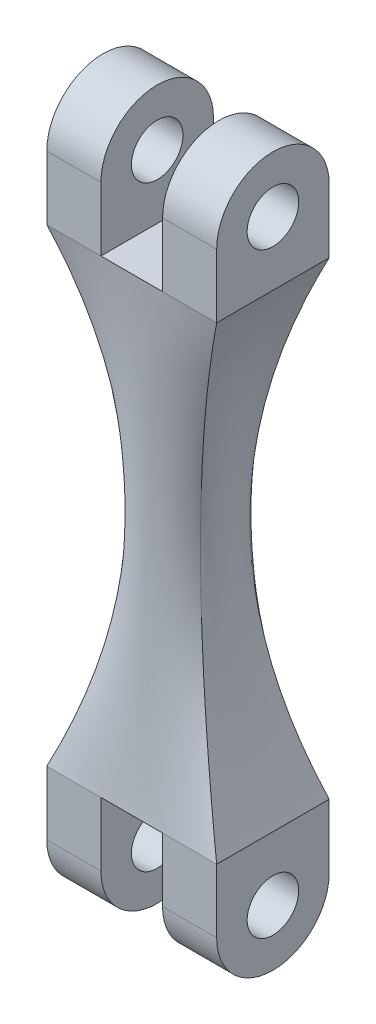
ISO-10303-21;
HEADER;
FILE_DESCRIPTION(('STEP AP214'),'2;1');
FILE_NAME('part.step','',(''),(''),'','','');
FILE_SCHEMA(('AUTOMOTIVE_DESIGN { 1 0 10303 214 1 1 1 1 }'));
ENDSEC;
DATA;
#1=APPLICATION_CONTEXT('core data for automotive mechanical design processes');
#2=APPLICATION_PROTOCOL_DEFINITION('international standard','automotive_design',2000,#1);
#3=PRODUCT_CONTEXT('',#1,'mechanical');
#4=PRODUCT('Part','Part','',(#3));
#5=PRODUCT_RELATED_PRODUCT_CATEGORY('part','',(#4));
#6=PRODUCT_DEFINITION_FORMATION('','',#4);
#7=PRODUCT_DEFINITION_CONTEXT('part definition',#1,'design');
#8=PRODUCT_DEFINITION('design','',#6,#7);
#9=PRODUCT_DEFINITION_SHAPE('','',#8);
#10=(LENGTH_UNIT() NAMED_UNIT(*) SI_UNIT(.MILLI.,.METRE.));
#11=(NAMED_UNIT(*) PLANE_ANGLE_UNIT() SI_UNIT($,.RADIAN.));
#12=(NAMED_UNIT(*) SI_UNIT($,.STERADIAN.) SOLID_ANGLE_UNIT());
#13=UNCERTAINTY_MEASURE_WITH_UNIT(LENGTH_MEASURE(1.E-05),#10,'distance_accuracy_value','');
#14=(GEOMETRIC_REPRESENTATION_CONTEXT(3) GLOBAL_UNCERTAINTY_ASSIGNED_CONTEXT((#13)) GLOBAL_UNIT_ASSIGNED_CONTEXT((#10,
#11,#12)) REPRESENTATION_CONTEXT('',''));
#15=CARTESIAN_POINT('',(0.,0.,0.));
#16=DIRECTION('',(0.,0.,1.));
#17=DIRECTION('',(1.,0.,0.));
#18=AXIS2_PLACEMENT_3D('',#15,#16,#17);
#19=CARTESIAN_POINT('',(0.,0.,0.));
#20=DIRECTION('',(0.,1.,0.));
#21=DIRECTION('',(0.,0.,1.));
#22=AXIS2_PLACEMENT_3D('',#19,#20,#21);
#23=PLANE('',#22);
#24=DIRECTION('',(-1.,0.,0.));
#25=VECTOR('',#24,1.);
#26=CARTESIAN_POINT('',(-4.529,0.,-3.));
#27=LINE('',#26,#25);
#28=CARTESIAN_POINT('',(1.643,0.,-3.));
#29=VERTEX_POINT('',#28);
#30=CARTESIAN_POINT('',(-1.643,0.,-3.));
#31=VERTEX_POINT('',#30);
#32=EDGE_CURVE('E472',#29,#31,#27,.T.);
#33=ORIENTED_EDGE('',*,*,#32,.F.);
#34=DIRECTION('',(0.,0.,1.));
#35=VECTOR('',#34,1.);
#36=CARTESIAN_POINT('',(1.643,0.,3.));
#37=LINE('',#36,#35);
#38=CARTESIAN_POINT('',(1.643,0.,3.));
#39=VERTEX_POINT('',#38);
#40=EDGE_CURVE('E736',#29,#39,#37,.T.);
#41=ORIENTED_EDGE('',*,*,#40,.T.);
#42=DIRECTION('',(1.,0.,0.));
#43=VECTOR('',#42,1.);
#44=CARTESIAN_POINT('',(-4.529,0.,3.));
#45=LINE('',#44,#43);
#46=CARTESIAN_POINT('',(-1.643,0.,3.));
#47=VERTEX_POINT('',#46);
#48=EDGE_CURVE('E351',#47,#39,#45,.T.);
#49=ORIENTED_EDGE('',*,*,#48,.F.);
#50=DIRECTION('',(0.,0.,1.));
#51=VECTOR('',#50,1.);
#52=CARTESIAN_POINT('',(-1.643,0.,3.));
#53=LINE('',#52,#51);
#54=EDGE_CURVE('E409',#31,#47,#53,.T.);
#55=ORIENTED_EDGE('',*,*,#54,.F.);
#56=EDGE_LOOP('',(#33,#41,#49,#55));
#57=FACE_BOUND('',#56,.T.);
#58=ADVANCED_FACE('F83',(#57),#23,.F.);
#59=CARTESIAN_POINT('',(0.,25.,0.));
#60=DIRECTION('',(0.,-1.,0.));
#61=DIRECTION('',(0.,0.,-1.));
#62=AXIS2_PLACEMENT_3D('',#59,#60,#61);
#63=PLANE('',#62);
#64=DIRECTION('',(1.,0.,0.));
#65=VECTOR('',#64,1.);
#66=CARTESIAN_POINT('',(-4.529,25.,3.));
#67=LINE('',#66,#65);
#68=CARTESIAN_POINT('',(-1.643,25.,3.));
#69=VERTEX_POINT('',#68);
#70=CARTESIAN_POINT('',(1.643,25.,3.));
#71=VERTEX_POINT('',#70);
#72=EDGE_CURVE('E94',#69,#71,#67,.T.);
#73=ORIENTED_EDGE('',*,*,#72,.T.);
#74=DIRECTION('',(0.,0.,1.));
#75=VECTOR('',#74,1.);
#76=CARTESIAN_POINT('',(1.643,25.,3.));
#77=LINE('',#76,#75);
#78=CARTESIAN_POINT('',(1.643,25.,-3.));
#79=VERTEX_POINT('',#78);
#80=EDGE_CURVE('E217',#79,#71,#77,.T.);
#81=ORIENTED_EDGE('',*,*,#80,.F.);
#82=DIRECTION('',(-1.,0.,0.));
#83=VECTOR('',#82,1.);
#84=CARTESIAN_POINT('',(-4.529,25.,-3.));
#85=LINE('',#84,#83);
#86=CARTESIAN_POINT('',(-1.643,25.,-3.));
#87=VERTEX_POINT('',#86);
#88=EDGE_CURVE('E344',#79,#87,#85,.T.);
#89=ORIENTED_EDGE('',*,*,#88,.T.);
#90=DIRECTION('',(0.,0.,1.));
#91=VECTOR('',#90,1.);
#92=CARTESIAN_POINT('',(-1.643,25.,3.));
#93=LINE('',#92,#91);
#94=EDGE_CURVE('E260',#87,#69,#93,.T.);
#95=ORIENTED_EDGE('',*,*,#94,.T.);
#96=EDGE_LOOP('',(#73,#81,#89,#95));
#97=FACE_BOUND('',#96,.T.);
#98=ADVANCED_FACE('F85',(#97),#63,.F.);
#99=CARTESIAN_POINT('',(-4.529,0.,3.));
#100=CARTESIAN_POINT('',(-2.82967454845478,4.16666666666667,1.87437042291109));
#101=CARTESIAN_POINT('',(-1.13034909690955,12.5,0.748740845822179));
#102=CARTESIAN_POINT('',(-2.82967454845478,20.8333333333333,1.87437042291109));
#103=CARTESIAN_POINT('',(-4.529,25.,3.));
#104=CARTESIAN_POINT('',(-4.15158333333333,0.,3.));
#105=CARTESIAN_POINT('',(-2.62298451265422,4.16666666666667,1.97864445794214));
#106=CARTESIAN_POINT('',(-1.11711278216476,12.5,0.976482291331089));
#107=CARTESIAN_POINT('',(-2.62298451265422,20.8333333333333,1.97864445794214));
#108=CARTESIAN_POINT('',(-4.15158333333333,25.,3.));
#109=CARTESIAN_POINT('',(-3.39675,0.,3.));
#110=CARTESIAN_POINT('',(-2.20960444105311,4.16666666666666,2.18719252800423));
#111=CARTESIAN_POINT('',(-1.01223163115228,12.5,1.36566080837681));
#112=CARTESIAN_POINT('',(-2.20960444105311,20.8333333333333,2.18719252800423));
#113=CARTESIAN_POINT('',(-3.39675,25.,3.));
#114=CARTESIAN_POINT('',(-1.88708333333333,0.,3.));
#115=CARTESIAN_POINT('',(-1.27993394314497,4.16666666666668,2.48170910900993));
#116=CARTESIAN_POINT('',(-0.678466627347054,12.5,1.96865270528451));
#117=CARTESIAN_POINT('',(-1.27993394314497,20.8333333333333,2.48170910900993));
#118=CARTESIAN_POINT('',(-1.88708333333333,25.,3.));
#119=CARTESIAN_POINT('',(0.,0.,3.));
#120=CARTESIAN_POINT('',(8.36980925779145E-05,4.16666666666665,2.65150795100174));
#121=CARTESIAN_POINT('',(0.000169810929422366,12.4999999999999,2.29952675477991));
#122=CARTESIAN_POINT('',(8.36980925766583E-05,20.8333333333333,2.65150795100173));
#123=CARTESIAN_POINT('',(0.,25.,3.));
#124=CARTESIAN_POINT('',(1.88708333333333,0.,3.));
#125=CARTESIAN_POINT('',(1.27977178462595,4.16666666666668,2.48175153838506));
#126=CARTESIAN_POINT('',(0.678135066076206,12.5,1.96873603117617));
#127=CARTESIAN_POINT('',(1.27977178462595,20.8333333333333,2.48175153838506));
#128=CARTESIAN_POINT('',(1.88708333333333,25.,3.));
#129=CARTESIAN_POINT('',(3.39675,0.,3.));
#130=CARTESIAN_POINT('',(2.20963100324003,4.16666666666667,2.18719865943864));
#131=CARTESIAN_POINT('',(1.01229682924744,12.5,1.36567583039112));
#132=CARTESIAN_POINT('',(2.20963100324003,20.8333333333333,2.18719865943864));
#133=CARTESIAN_POINT('',(3.39675,25.,3.));
#134=CARTESIAN_POINT('',(4.15158333333333,0.,3.));
#135=CARTESIAN_POINT('',(2.62299336671653,4.16666666666667,1.97864650175361));
#136=CARTESIAN_POINT('',(1.11710392810245,12.5,0.976480247519622));
#137=CARTESIAN_POINT('',(2.62299336671653,20.8333333333333,1.97864650175361));
#138=CARTESIAN_POINT('',(4.15158333333333,25.,3.));
#139=CARTESIAN_POINT('',(4.529,0.,3.));
#140=CARTESIAN_POINT('',(2.82967454845478,4.16666666666667,1.87437042291109));
#141=CARTESIAN_POINT('',(1.13034909690955,12.5,0.748740845822179));
#142=CARTESIAN_POINT('',(2.82967454845478,20.8333333333333,1.87437042291109));
#143=CARTESIAN_POINT('',(4.529,25.,3.));
#144=B_SPLINE_SURFACE_WITH_KNOTS('',3,3,((#99,#100,#101,#102,#103),(#104,#105,#106,#107,#108),
(#109,#110,#111,#112,#113),(#114,#115,#116,#117,#118),(#119,#120,#121,#122,#123),(#124,#125,
#126,#127,#128),(#129,#130,#131,#132,#133),(#134,#135,#136,#137,#138),(#139,#140,#141,#142,
#143)),.UNSPECIFIED.,.F.,.F.,.F.,(4,1,1,1,1,1,4),(4,1,4),(0.,0.125,0.25,0.5,0.75,0.875,1.),(0.,
0.5,1.),.UNSPECIFIED.);
#145=CARTESIAN_POINT('',(-4.529,0.,3.));
#146=VERTEX_POINT('',#145);
#147=EDGE_CURVE('E473',#146,#47,#45,.T.);
#148=DIRECTION('',(1.,0.,0.));
#149=VECTOR('',#148,1.);
#150=CARTESIAN_POINT('',(1.643,0.,3.));
#151=LINE('',#150,#149);
#152=CARTESIAN_POINT('',(4.529,0.,3.));
#153=VERTEX_POINT('',#152);
#154=EDGE_CURVE('E556',#39,#153,#151,.T.);
#155=CARTESIAN_POINT('',(4.529,0.,3.));
#156=CARTESIAN_POINT('',(2.82967454845478,4.16666666666667,1.87437042291109));
#157=CARTESIAN_POINT('',(1.13034909690955,12.5,0.748740845822179));
#158=CARTESIAN_POINT('',(2.82967454845478,20.8333333333333,1.87437042291109));
#159=CARTESIAN_POINT('',(4.529,25.,3.));
#160=B_SPLINE_CURVE_WITH_KNOTS('',3,(#155,#156,#157,#158,#159),.UNSPECIFIED.,.F.,.F.,(4,1,4),
(0.,0.5,1.),.UNSPECIFIED.);
#161=CARTESIAN_POINT('',(4.529,25.,3.));
#162=VERTEX_POINT('',#161);
#163=EDGE_CURVE('E565',#153,#162,#160,.T.);
#164=DIRECTION('',(1.,0.,0.));
#165=VECTOR('',#164,1.);
#166=CARTESIAN_POINT('',(1.643,25.,3.));
#167=LINE('',#166,#165);
#168=EDGE_CURVE('E102',#71,#162,#167,.T.);
#169=CARTESIAN_POINT('',(-4.529,25.,3.));
#170=VERTEX_POINT('',#169);
#171=EDGE_CURVE('E12',#170,#69,#67,.T.);
#172=CARTESIAN_POINT('',(-4.529,0.,3.));
#173=CARTESIAN_POINT('',(-2.82967454845478,4.16666666666667,1.87437042291109));
#174=CARTESIAN_POINT('',(-1.13034909690955,12.5,0.748740845822179));
#175=CARTESIAN_POINT('',(-2.82967454845478,20.8333333333333,1.87437042291109));
#176=CARTESIAN_POINT('',(-4.529,25.,3.));
#177=B_SPLINE_CURVE_WITH_KNOTS('',3,(#172,#173,#174,#175,#176),.UNSPECIFIED.,.F.,.F.,(4,1,4),
(0.,0.5,1.),.UNSPECIFIED.);
#178=EDGE_CURVE('E649',#170,#146,#177,.F.);
#179=ORIENTED_EDGE('',*,*,#147,.T.);
#180=ORIENTED_EDGE('',*,*,#48,.T.);
#181=ORIENTED_EDGE('',*,*,#154,.T.);
#182=ORIENTED_EDGE('',*,*,#163,.T.);
#183=ORIENTED_EDGE('',*,*,#168,.F.);
#184=ORIENTED_EDGE('',*,*,#72,.F.);
#185=ORIENTED_EDGE('',*,*,#171,.F.);
#186=ORIENTED_EDGE('',*,*,#178,.T.);
#187=EDGE_LOOP('',(#179,#180,#181,#182,#183,#184,#185,#186));
#188=FACE_BOUND('',#187,.T.);
#189=ADVANCED_FACE('F534',(#188),#144,.T.);
#190=CARTESIAN_POINT('',(4.529,0.,3.));
#191=CARTESIAN_POINT('',(2.82967454845478,4.16666666666667,1.87437042291109));
#192=CARTESIAN_POINT('',(1.13034909690955,12.5,0.748740845822179));
#193=CARTESIAN_POINT('',(2.82967454845477,20.8333333333333,1.87437042291109));
#194=CARTESIAN_POINT('',(4.529,25.,3.));
#195=CARTESIAN_POINT('',(4.529,0.,1.));
#196=CARTESIAN_POINT('',(2.82967454845477,4.16666666666667,0.624790140970363));
#197=CARTESIAN_POINT('',(2.18342179018679,12.5,0.40853238514536));
#198=CARTESIAN_POINT('',(2.82967454845477,20.8333333333333,0.624790140970363));
#199=CARTESIAN_POINT('',(4.529,25.,1.));
#200=CARTESIAN_POINT('',(4.529,0.,-1.));
#201=CARTESIAN_POINT('',(2.82967454845477,4.16666666666667,-0.624790140970363));
#202=CARTESIAN_POINT('',(2.18342179018679,12.5,-0.40853238514536));
#203=CARTESIAN_POINT('',(2.82967454845477,20.8333333333333,-0.624790140970363));
#204=CARTESIAN_POINT('',(4.529,25.,-1.));
#205=CARTESIAN_POINT('',(4.529,0.,-3.));
#206=CARTESIAN_POINT('',(2.82967454845477,4.16666666666667,-1.87437042291109));
#207=CARTESIAN_POINT('',(1.13034909690955,12.5,-0.748740845822179));
#208=CARTESIAN_POINT('',(2.82967454845477,20.8333333333333,-1.87437042291109));
#209=CARTESIAN_POINT('',(4.529,25.,-3.));
#210=B_SPLINE_SURFACE_WITH_KNOTS('',3,3,((#190,#191,#192,#193,#194),(#195,#196,#197,#198,#199),
(#200,#201,#202,#203,#204),(#205,#206,#207,#208,#209)),.UNSPECIFIED.,.F.,.F.,.F.,(4,4),(4,1,4),
(0.,1.),(0.,0.5,1.),.UNSPECIFIED.);
#211=DIRECTION('',(0.,0.,-1.));
#212=VECTOR('',#211,1.);
#213=CARTESIAN_POINT('',(4.529,0.,-3.));
#214=LINE('',#213,#212);
#215=CARTESIAN_POINT('',(4.529,0.,-3.));
#216=VERTEX_POINT('',#215);
#217=EDGE_CURVE('E434',#153,#216,#214,.T.);
#218=CARTESIAN_POINT('',(4.529,0.,-3.));
#219=CARTESIAN_POINT('',(2.82967454845477,4.16666666666667,-1.87437042291109));
#220=CARTESIAN_POINT('',(1.13034909690955,12.5,-0.748740845822179));
#221=CARTESIAN_POINT('',(2.82967454845477,20.8333333333333,-1.87437042291109));
#222=CARTESIAN_POINT('',(4.529,25.,-3.));
#223=B_SPLINE_CURVE_WITH_KNOTS('',3,(#218,#219,#220,#221,#222),.UNSPECIFIED.,.F.,.F.,(4,1,4),
(0.,0.5,1.),.UNSPECIFIED.);
#224=CARTESIAN_POINT('',(4.529,25.,-3.));
#225=VERTEX_POINT('',#224);
#226=EDGE_CURVE('E391',#216,#225,#223,.T.);
#227=DIRECTION('',(0.,0.,-1.));
#228=VECTOR('',#227,1.);
#229=CARTESIAN_POINT('',(4.529,25.,3.));
#230=LINE('',#229,#228);
#231=EDGE_CURVE('E605',#162,#225,#230,.T.);
#232=ORIENTED_EDGE('',*,*,#217,.T.);
#233=ORIENTED_EDGE('',*,*,#226,.T.);
#234=ORIENTED_EDGE('',*,*,#231,.F.);
#235=ORIENTED_EDGE('',*,*,#163,.F.);
#236=EDGE_LOOP('',(#232,#233,#234,#235));
#237=FACE_BOUND('',#236,.T.);
#238=ADVANCED_FACE('F608',(#237),#210,.T.);
#239=CARTESIAN_POINT('',(-4.529,0.,-3.));
#240=CARTESIAN_POINT('',(-2.82967454845477,4.16666666666667,-1.87437042291109));
#241=CARTESIAN_POINT('',(-1.13034909690955,12.5,-0.748740845822179));
#242=CARTESIAN_POINT('',(-2.82967454845477,20.8333333333333,-1.87437042291109));
#243=CARTESIAN_POINT('',(-4.529,25.,-3.));
#244=CARTESIAN_POINT('',(-4.529,0.,-1.));
#245=CARTESIAN_POINT('',(-2.82967454845477,4.16666666666667,-0.624790140970363));
#246=CARTESIAN_POINT('',(-2.18342179018679,12.5,-0.40853238514536));
#247=CARTESIAN_POINT('',(-2.82967454845477,20.8333333333333,-0.624790140970363));
#248=CARTESIAN_POINT('',(-4.529,25.,-1.));
#249=CARTESIAN_POINT('',(-4.529,0.,1.));
#250=CARTESIAN_POINT('',(-2.82967454845477,4.16666666666667,0.624790140970363));
#251=CARTESIAN_POINT('',(-2.18342179018679,12.5,0.408532385145359));
#252=CARTESIAN_POINT('',(-2.82967454845477,20.8333333333333,0.624790140970363));
#253=CARTESIAN_POINT('',(-4.529,25.,1.));
#254=CARTESIAN_POINT('',(-4.529,0.,3.));
#255=CARTESIAN_POINT('',(-2.82967454845477,4.16666666666667,1.87437042291109));
#256=CARTESIAN_POINT('',(-1.13034909690955,12.5,0.748740845822178));
#257=CARTESIAN_POINT('',(-2.82967454845477,20.8333333333333,1.87437042291109));
#258=CARTESIAN_POINT('',(-4.529,25.,3.));
#259=B_SPLINE_SURFACE_WITH_KNOTS('',3,3,((#239,#240,#241,#242,#243),(#244,#245,#246,#247,#248),
(#249,#250,#251,#252,#253),(#254,#255,#256,#257,#258)),.UNSPECIFIED.,.F.,.F.,.F.,(4,4),(4,1,4),
(0.,1.),(0.,0.5,1.),.UNSPECIFIED.);
#260=DIRECTION('',(0.,0.,1.));
#261=VECTOR('',#260,1.);
#262=CARTESIAN_POINT('',(-4.529,0.,-3.));
#263=LINE('',#262,#261);
#264=CARTESIAN_POINT('',(-4.529,0.,-3.));
#265=VERTEX_POINT('',#264);
#266=EDGE_CURVE('E464',#265,#146,#263,.T.);
#267=DIRECTION('',(0.,0.,1.));
#268=VECTOR('',#267,1.);
#269=CARTESIAN_POINT('',(-4.529,25.,3.));
#270=LINE('',#269,#268);
#271=CARTESIAN_POINT('',(-4.529,25.,-3.));
#272=VERTEX_POINT('',#271);
#273=EDGE_CURVE('E290',#272,#170,#270,.T.);
#274=CARTESIAN_POINT('',(-4.529,0.,-3.));
#275=CARTESIAN_POINT('',(-2.82967454845478,4.16666666666667,-1.87437042291109));
#276=CARTESIAN_POINT('',(-1.13034909690955,12.5,-0.748740845822178));
#277=CARTESIAN_POINT('',(-2.82967454845478,20.8333333333333,-1.87437042291109));
#278=CARTESIAN_POINT('',(-4.529,25.,-3.));
#279=B_SPLINE_CURVE_WITH_KNOTS('',3,(#274,#275,#276,#277,#278),.UNSPECIFIED.,.F.,.F.,(4,1,4),
(0.,0.5,1.),.UNSPECIFIED.);
#280=EDGE_CURVE('E348',#265,#272,#279,.T.);
#281=ORIENTED_EDGE('',*,*,#266,.T.);
#282=ORIENTED_EDGE('',*,*,#178,.F.);
#283=ORIENTED_EDGE('',*,*,#273,.F.);
#284=ORIENTED_EDGE('',*,*,#280,.F.);
#285=EDGE_LOOP('',(#281,#282,#283,#284));
#286=FACE_BOUND('',#285,.T.);
#287=ADVANCED_FACE('F374',(#286),#259,.T.);
#288=CARTESIAN_POINT('',(4.529,0.,-3.));
#289=CARTESIAN_POINT('',(2.82967454845477,4.16666666666667,-1.87437042291109));
#290=CARTESIAN_POINT('',(1.13034909690955,12.5,-0.748740845822179));
#291=CARTESIAN_POINT('',(2.82967454845478,20.8333333333333,-1.87437042291109));
#292=CARTESIAN_POINT('',(4.529,25.,-3.));
#293=CARTESIAN_POINT('',(4.15158333333333,0.,-3.));
#294=CARTESIAN_POINT('',(2.62298451265422,4.16666666666667,-1.97864445794214));
#295=CARTESIAN_POINT('',(1.11711278216476,12.5,-0.97648229133109));
#296=CARTESIAN_POINT('',(2.62298451265422,20.8333333333333,-1.97864445794214));
#297=CARTESIAN_POINT('',(4.15158333333333,25.,-3.));
#298=CARTESIAN_POINT('',(3.39675,0.,-3.));
#299=CARTESIAN_POINT('',(2.20960444105311,4.16666666666666,-2.18719252800423));
#300=CARTESIAN_POINT('',(1.01223163115228,12.5,-1.36566080837681));
#301=CARTESIAN_POINT('',(2.20960444105311,20.8333333333333,-2.18719252800423));
#302=CARTESIAN_POINT('',(3.39675,25.,-3.));
#303=CARTESIAN_POINT('',(1.88708333333333,0.,-3.));
#304=CARTESIAN_POINT('',(1.27993394314497,4.16666666666667,-2.48170910900993));
#305=CARTESIAN_POINT('',(0.678466627347053,12.5,-1.96865270528451));
#306=CARTESIAN_POINT('',(1.27993394314497,20.8333333333333,-2.48170910900993));
#307=CARTESIAN_POINT('',(1.88708333333333,25.,-3.));
#308=CARTESIAN_POINT('',(0.,0.,-3.));
#309=CARTESIAN_POINT('',(-8.36980925789987E-05,4.16666666666666,-2.65150795100173));
#310=CARTESIAN_POINT('',(-0.00016981092941997,12.5,-2.29952675477991));
#311=CARTESIAN_POINT('',(-8.36980925760301E-05,20.8333333333333,-2.65150795100174));
#312=CARTESIAN_POINT('',(0.,25.,-3.));
#313=CARTESIAN_POINT('',(-1.88708333333333,0.,-3.));
#314=CARTESIAN_POINT('',(-1.27977178462595,4.16666666666667,-2.48175153838506));
#315=CARTESIAN_POINT('',(-0.678135066076209,12.5,-1.96873603117617));
#316=CARTESIAN_POINT('',(-1.27977178462595,20.8333333333333,-2.48175153838506));
#317=CARTESIAN_POINT('',(-1.88708333333333,25.,-3.));
#318=CARTESIAN_POINT('',(-3.39675,0.,-3.));
#319=CARTESIAN_POINT('',(-2.20963100324003,4.16666666666667,-2.18719865943864));
#320=CARTESIAN_POINT('',(-1.01229682924744,12.5,-1.36567583039112));
#321=CARTESIAN_POINT('',(-2.20963100324003,20.8333333333333,-2.18719865943864));
#322=CARTESIAN_POINT('',(-3.39675,25.,-3.));
#323=CARTESIAN_POINT('',(-4.15158333333333,0.,-3.));
#324=CARTESIAN_POINT('',(-2.62299336671653,4.16666666666667,-1.97864650175361));
#325=CARTESIAN_POINT('',(-1.11710392810245,12.5,-0.976480247519619));
#326=CARTESIAN_POINT('',(-2.62299336671653,20.8333333333333,-1.97864650175361));
#327=CARTESIAN_POINT('',(-4.15158333333333,25.,-3.));
#328=CARTESIAN_POINT('',(-4.529,0.,-3.));
#329=CARTESIAN_POINT('',(-2.82967454845478,4.16666666666667,-1.87437042291109));
#330=CARTESIAN_POINT('',(-1.13034909690955,12.5,-0.748740845822178));
#331=CARTESIAN_POINT('',(-2.82967454845478,20.8333333333333,-1.87437042291109));
#332=CARTESIAN_POINT('',(-4.529,25.,-3.));
#333=B_SPLINE_SURFACE_WITH_KNOTS('',3,3,((#288,#289,#290,#291,#292),(#293,#294,#295,#296,#297),
(#298,#299,#300,#301,#302),(#303,#304,#305,#306,#307),(#308,#309,#310,#311,#312),(#313,#314,
#315,#316,#317),(#318,#319,#320,#321,#322),(#323,#324,#325,#326,#327),(#328,#329,#330,#331,
#332)),.UNSPECIFIED.,.F.,.F.,.F.,(4,1,1,1,1,1,4),(4,1,4),(0.,0.125,0.25,0.5,0.75,0.875,1.),(0.,
0.5,1.),.UNSPECIFIED.);
#334=EDGE_CURVE('E644',#216,#29,#27,.T.);
#335=DIRECTION('',(-1.,0.,0.));
#336=VECTOR('',#335,1.);
#337=CARTESIAN_POINT('',(-1.643,0.,-3.));
#338=LINE('',#337,#336);
#339=EDGE_CURVE('E405',#31,#265,#338,.T.);
#340=DIRECTION('',(-1.,0.,0.));
#341=VECTOR('',#340,1.);
#342=CARTESIAN_POINT('',(-1.643,25.,-3.));
#343=LINE('',#342,#341);
#344=EDGE_CURVE('E276',#87,#272,#343,.T.);
#345=EDGE_CURVE('E212',#225,#79,#85,.T.);
#346=ORIENTED_EDGE('',*,*,#334,.T.);
#347=ORIENTED_EDGE('',*,*,#32,.T.);
#348=ORIENTED_EDGE('',*,*,#339,.T.);
#349=ORIENTED_EDGE('',*,*,#280,.T.);
#350=ORIENTED_EDGE('',*,*,#344,.F.);
#351=ORIENTED_EDGE('',*,*,#88,.F.);
#352=ORIENTED_EDGE('',*,*,#345,.F.);
#353=ORIENTED_EDGE('',*,*,#226,.F.);
#354=EDGE_LOOP('',(#346,#347,#348,#349,#350,#351,#352,#353));
#355=FACE_BOUND('',#354,.T.);
#356=ADVANCED_FACE('F343',(#355),#333,.T.);
#357=CARTESIAN_POINT('',(-1.643,-3.4,0.));
#358=DIRECTION('',(1.,0.,0.));
#359=DIRECTION('',(0.,0.,-1.));
#360=AXIS2_PLACEMENT_3D('',#357,#358,#359);
#361=PLANE('',#360);
#362=CARTESIAN_POINT('',(-1.643,-3.4,0.));
#363=DIRECTION('',(1.,0.,0.));
#364=DIRECTION('',(0.,0.,-1.));
#365=AXIS2_PLACEMENT_3D('',#362,#363,#364);
#366=CIRCLE('',#365,3.);
#367=CARTESIAN_POINT('',(-1.643,-3.4,3.));
#368=VERTEX_POINT('',#367);
#369=CARTESIAN_POINT('',(-1.643,-3.4,-3.));
#370=VERTEX_POINT('',#369);
#371=EDGE_CURVE('E420',#368,#370,#366,.T.);
#372=ORIENTED_EDGE('',*,*,#371,.T.);
#373=DIRECTION('',(0.,1.,0.));
#374=VECTOR('',#373,1.);
#375=CARTESIAN_POINT('',(-1.643,-3.4,-3.));
#376=LINE('',#375,#374);
#377=EDGE_CURVE('E415',#370,#31,#376,.T.);
#378=ORIENTED_EDGE('',*,*,#377,.T.);
#379=ORIENTED_EDGE('',*,*,#54,.T.);
#380=DIRECTION('',(0.,-1.,0.));
#381=VECTOR('',#380,1.);
#382=CARTESIAN_POINT('',(-1.643,-3.4,3.));
#383=LINE('',#382,#381);
#384=EDGE_CURVE('E414',#47,#368,#383,.T.);
#385=ORIENTED_EDGE('',*,*,#384,.T.);
#386=EDGE_LOOP('',(#372,#378,#379,#385));
#387=FACE_BOUND('',#386,.T.);
#388=CARTESIAN_POINT('',(-1.643,-3.4,0.));
#389=DIRECTION('',(1.,0.,0.));
#390=DIRECTION('',(0.,0.,-1.));
#391=AXIS2_PLACEMENT_3D('',#388,#389,#390);
#392=CIRCLE('',#391,1.375);
#393=CARTESIAN_POINT('',(-1.643,-3.4,-1.375));
#394=VERTEX_POINT('',#393);
#395=EDGE_CURVE('E427',#394,#394,#392,.T.);
#396=ORIENTED_EDGE('',*,*,#395,.F.);
#397=EDGE_LOOP('',(#396));
#398=FACE_BOUND('',#397,.T.);
#399=ADVANCED_FACE('F373',(#387,#398),#361,.T.);
#400=CARTESIAN_POINT('',(-4.529,-3.4,0.));
#401=DIRECTION('',(1.,0.,0.));
#402=DIRECTION('',(0.,0.,-1.));
#403=AXIS2_PLACEMENT_3D('',#400,#401,#402);
#404=PLANE('',#403);
#405=CARTESIAN_POINT('',(-4.529,-3.4,0.));
#406=DIRECTION('',(1.,0.,0.));
#407=DIRECTION('',(0.,0.,-1.));
#408=AXIS2_PLACEMENT_3D('',#405,#406,#407);
#409=CIRCLE('',#408,3.);
#410=CARTESIAN_POINT('',(-4.529,-3.4,3.));
#411=VERTEX_POINT('',#410);
#412=CARTESIAN_POINT('',(-4.529,-3.4,-3.));
#413=VERTEX_POINT('',#412);
#414=EDGE_CURVE('E422',#411,#413,#409,.T.);
#415=ORIENTED_EDGE('',*,*,#414,.F.);
#416=DIRECTION('',(0.,-1.,0.));
#417=VECTOR('',#416,1.);
#418=CARTESIAN_POINT('',(-4.529,-3.4,3.));
#419=LINE('',#418,#417);
#420=EDGE_CURVE('E462',#146,#411,#419,.T.);
#421=ORIENTED_EDGE('',*,*,#420,.F.);
#422=ORIENTED_EDGE('',*,*,#266,.F.);
#423=DIRECTION('',(0.,1.,0.));
#424=VECTOR('',#423,1.);
#425=CARTESIAN_POINT('',(-4.529,-3.4,-3.));
#426=LINE('',#425,#424);
#427=EDGE_CURVE('E426',#413,#265,#426,.T.);
#428=ORIENTED_EDGE('',*,*,#427,.F.);
#429=EDGE_LOOP('',(#415,#421,#422,#428));
#430=FACE_BOUND('',#429,.T.);
#431=CARTESIAN_POINT('',(-4.529,-3.4,0.));
#432=DIRECTION('',(1.,0.,0.));
#433=DIRECTION('',(0.,0.,-1.));
#434=AXIS2_PLACEMENT_3D('',#431,#432,#433);
#435=CIRCLE('',#434,1.375);
#436=CARTESIAN_POINT('',(-4.529,-3.4,-1.375));
#437=VERTEX_POINT('',#436);
#438=EDGE_CURVE('E769',#437,#437,#435,.T.);
#439=ORIENTED_EDGE('',*,*,#438,.T.);
#440=EDGE_LOOP('',(#439));
#441=FACE_BOUND('',#440,.T.);
#442=ADVANCED_FACE('F466',(#430,#441),#404,.F.);
#443=CARTESIAN_POINT('',(-1.643,-3.4,0.));
#444=DIRECTION('',(-1.,0.,0.));
#445=DIRECTION('',(0.,0.,1.));
#446=AXIS2_PLACEMENT_3D('',#443,#444,#445);
#447=CYLINDRICAL_SURFACE('',#446,3.);
#448=ORIENTED_EDGE('',*,*,#414,.T.);
#449=DIRECTION('',(-1.,0.,0.));
#450=VECTOR('',#449,1.);
#451=CARTESIAN_POINT('',(-1.643,-3.4,-3.));
#452=LINE('',#451,#450);
#453=EDGE_CURVE('E431',#370,#413,#452,.T.);
#454=ORIENTED_EDGE('',*,*,#453,.F.);
#455=ORIENTED_EDGE('',*,*,#371,.F.);
#456=DIRECTION('',(-1.,0.,0.));
#457=VECTOR('',#456,1.);
#458=CARTESIAN_POINT('',(-1.643,-3.4,3.));
#459=LINE('',#458,#457);
#460=EDGE_CURVE('E428',#368,#411,#459,.T.);
#461=ORIENTED_EDGE('',*,*,#460,.T.);
#462=EDGE_LOOP('',(#448,#454,#455,#461));
#463=FACE_BOUND('',#462,.T.);
#464=ADVANCED_FACE('F491',(#463),#447,.T.);
#465=CARTESIAN_POINT('',(-1.643,-3.4,-3.));
#466=DIRECTION('',(0.,0.,1.));
#467=DIRECTION('',(1.,0.,0.));
#468=AXIS2_PLACEMENT_3D('',#465,#466,#467);
#469=PLANE('',#468);
#470=ORIENTED_EDGE('',*,*,#427,.T.);
#471=ORIENTED_EDGE('',*,*,#339,.F.);
#472=ORIENTED_EDGE('',*,*,#377,.F.);
#473=ORIENTED_EDGE('',*,*,#453,.T.);
#474=EDGE_LOOP('',(#470,#471,#472,#473));
#475=FACE_BOUND('',#474,.T.);
#476=ADVANCED_FACE('F455',(#475),#469,.F.);
#477=CARTESIAN_POINT('',(-1.643,-3.4,3.));
#478=DIRECTION('',(0.,0.,-1.));
#479=DIRECTION('',(0.,1.,0.));
#480=AXIS2_PLACEMENT_3D('',#477,#478,#479);
#481=PLANE('',#480);
#482=ORIENTED_EDGE('',*,*,#420,.T.);
#483=ORIENTED_EDGE('',*,*,#460,.F.);
#484=ORIENTED_EDGE('',*,*,#384,.F.);
#485=ORIENTED_EDGE('',*,*,#147,.F.);
#486=EDGE_LOOP('',(#482,#483,#484,#485));
#487=FACE_BOUND('',#486,.T.);
#488=ADVANCED_FACE('F493',(#487),#481,.F.);
#489=CARTESIAN_POINT('',(-1.643,-3.4,0.));
#490=DIRECTION('',(-1.,0.,0.));
#491=DIRECTION('',(0.,0.,1.));
#492=AXIS2_PLACEMENT_3D('',#489,#490,#491);
#493=CYLINDRICAL_SURFACE('',#492,1.375);
#494=ORIENTED_EDGE('',*,*,#395,.T.);
#495=EDGE_LOOP('',(#494));
#496=FACE_BOUND('',#495,.T.);
#497=ORIENTED_EDGE('',*,*,#438,.F.);
#498=EDGE_LOOP('',(#497));
#499=FACE_BOUND('',#498,.T.);
#500=ADVANCED_FACE('F496',(#496,#499),#493,.F.);
#501=CARTESIAN_POINT('',(1.643,-3.4,0.));
#502=DIRECTION('',(1.,0.,0.));
#503=DIRECTION('',(0.,0.,-1.));
#504=AXIS2_PLACEMENT_3D('',#501,#502,#503);
#505=CYLINDRICAL_SURFACE('',#504,3.);
#506=CARTESIAN_POINT('',(4.529,-3.4,0.));
#507=DIRECTION('',(1.,0.,0.));
#508=DIRECTION('',(0.,0.,-1.));
#509=AXIS2_PLACEMENT_3D('',#506,#507,#508);
#510=CIRCLE('',#509,3.);
#511=CARTESIAN_POINT('',(4.529,-3.4,3.));
#512=VERTEX_POINT('',#511);
#513=CARTESIAN_POINT('',(4.529,-3.4,-3.));
#514=VERTEX_POINT('',#513);
#515=EDGE_CURVE('E750',#512,#514,#510,.T.);
#516=ORIENTED_EDGE('',*,*,#515,.F.);
#517=DIRECTION('',(1.,0.,0.));
#518=VECTOR('',#517,1.);
#519=CARTESIAN_POINT('',(1.643,-3.4,3.));
#520=LINE('',#519,#518);
#521=CARTESIAN_POINT('',(1.643,-3.4,3.));
#522=VERTEX_POINT('',#521);
#523=EDGE_CURVE('E741',#522,#512,#520,.T.);
#524=ORIENTED_EDGE('',*,*,#523,.F.);
#525=CARTESIAN_POINT('',(1.643,-3.4,0.));
#526=DIRECTION('',(1.,0.,0.));
#527=DIRECTION('',(0.,0.,-1.));
#528=AXIS2_PLACEMENT_3D('',#525,#526,#527);
#529=CIRCLE('',#528,3.);
#530=CARTESIAN_POINT('',(1.643,-3.4,-3.));
#531=VERTEX_POINT('',#530);
#532=EDGE_CURVE('E737',#522,#531,#529,.T.);
#533=ORIENTED_EDGE('',*,*,#532,.T.);
#534=DIRECTION('',(1.,0.,0.));
#535=VECTOR('',#534,1.);
#536=CARTESIAN_POINT('',(1.643,-3.4,-3.));
#537=LINE('',#536,#535);
#538=EDGE_CURVE('E742',#531,#514,#537,.T.);
#539=ORIENTED_EDGE('',*,*,#538,.T.);
#540=EDGE_LOOP('',(#516,#524,#533,#539));
#541=FACE_BOUND('',#540,.T.);
#542=ADVANCED_FACE('F720',(#541),#505,.T.);
#543=CARTESIAN_POINT('',(1.643,-3.4,3.));
#544=DIRECTION('',(0.,0.,1.));
#545=DIRECTION('',(0.,-1.,0.));
#546=AXIS2_PLACEMENT_3D('',#543,#544,#545);
#547=PLANE('',#546);
#548=DIRECTION('',(0.,-1.,0.));
#549=VECTOR('',#548,1.);
#550=CARTESIAN_POINT('',(4.529,-3.4,3.));
#551=LINE('',#550,#549);
#552=EDGE_CURVE('E747',#153,#512,#551,.T.);
#553=ORIENTED_EDGE('',*,*,#552,.F.);
#554=ORIENTED_EDGE('',*,*,#154,.F.);
#555=DIRECTION('',(0.,-1.,0.));
#556=VECTOR('',#555,1.);
#557=CARTESIAN_POINT('',(1.643,-3.4,3.));
#558=LINE('',#557,#556);
#559=EDGE_CURVE('E727',#39,#522,#558,.T.);
#560=ORIENTED_EDGE('',*,*,#559,.T.);
#561=ORIENTED_EDGE('',*,*,#523,.T.);
#562=EDGE_LOOP('',(#553,#554,#560,#561));
#563=FACE_BOUND('',#562,.T.);
#564=ADVANCED_FACE('F713',(#563),#547,.T.);
#565=CARTESIAN_POINT('',(1.643,-3.4,-3.));
#566=DIRECTION('',(0.,0.,-1.));
#567=DIRECTION('',(-1.,0.,0.));
#568=AXIS2_PLACEMENT_3D('',#565,#566,#567);
#569=PLANE('',#568);
#570=DIRECTION('',(0.,1.,0.));
#571=VECTOR('',#570,1.);
#572=CARTESIAN_POINT('',(4.529,-3.4,-3.));
#573=LINE('',#572,#571);
#574=EDGE_CURVE('E701',#514,#216,#573,.T.);
#575=ORIENTED_EDGE('',*,*,#574,.F.);
#576=ORIENTED_EDGE('',*,*,#538,.F.);
#577=DIRECTION('',(0.,1.,0.));
#578=VECTOR('',#577,1.);
#579=CARTESIAN_POINT('',(1.643,-3.4,-3.));
#580=LINE('',#579,#578);
#581=EDGE_CURVE('E558',#531,#29,#580,.T.);
#582=ORIENTED_EDGE('',*,*,#581,.T.);
#583=ORIENTED_EDGE('',*,*,#334,.F.);
#584=EDGE_LOOP('',(#575,#576,#582,#583));
#585=FACE_BOUND('',#584,.T.);
#586=ADVANCED_FACE('F702',(#585),#569,.T.);
#587=CARTESIAN_POINT('',(1.643,-3.4,0.));
#588=DIRECTION('',(-1.,0.,0.));
#589=DIRECTION('',(0.,0.,-1.));
#590=AXIS2_PLACEMENT_3D('',#587,#588,#589);
#591=PLANE('',#590);
#592=CARTESIAN_POINT('',(1.643,-3.4,0.));
#593=DIRECTION('',(1.,0.,0.));
#594=DIRECTION('',(0.,0.,-1.));
#595=AXIS2_PLACEMENT_3D('',#592,#593,#594);
#596=CIRCLE('',#595,1.375);
#597=CARTESIAN_POINT('',(1.643,-3.4,-1.375));
#598=VERTEX_POINT('',#597);
#599=EDGE_CURVE('E755',#598,#598,#596,.T.);
#600=ORIENTED_EDGE('',*,*,#599,.T.);
#601=EDGE_LOOP('',(#600));
#602=FACE_BOUND('',#601,.T.);
#603=ORIENTED_EDGE('',*,*,#532,.F.);
#604=ORIENTED_EDGE('',*,*,#559,.F.);
#605=ORIENTED_EDGE('',*,*,#40,.F.);
#606=ORIENTED_EDGE('',*,*,#581,.F.);
#607=EDGE_LOOP('',(#603,#604,#605,#606));
#608=FACE_BOUND('',#607,.T.);
#609=ADVANCED_FACE('F712',(#602,#608),#591,.T.);
#610=CARTESIAN_POINT('',(4.529,-3.4,0.));
#611=DIRECTION('',(-1.,0.,0.));
#612=DIRECTION('',(0.,0.,-1.));
#613=AXIS2_PLACEMENT_3D('',#610,#611,#612);
#614=PLANE('',#613);
#615=CARTESIAN_POINT('',(4.529,-3.4,0.));
#616=DIRECTION('',(1.,0.,0.));
#617=DIRECTION('',(0.,0.,-1.));
#618=AXIS2_PLACEMENT_3D('',#615,#616,#617);
#619=CIRCLE('',#618,1.375);
#620=CARTESIAN_POINT('',(4.529,-3.4,-1.375));
#621=VERTEX_POINT('',#620);
#622=EDGE_CURVE('E760',#621,#621,#619,.T.);
#623=ORIENTED_EDGE('',*,*,#622,.F.);
#624=EDGE_LOOP('',(#623));
#625=FACE_BOUND('',#624,.T.);
#626=ORIENTED_EDGE('',*,*,#515,.T.);
#627=ORIENTED_EDGE('',*,*,#574,.T.);
#628=ORIENTED_EDGE('',*,*,#217,.F.);
#629=ORIENTED_EDGE('',*,*,#552,.T.);
#630=EDGE_LOOP('',(#626,#627,#628,#629));
#631=FACE_BOUND('',#630,.T.);
#632=ADVANCED_FACE('F714',(#625,#631),#614,.F.);
#633=CARTESIAN_POINT('',(1.643,-3.4,0.));
#634=DIRECTION('',(1.,0.,0.));
#635=DIRECTION('',(0.,0.,-1.));
#636=AXIS2_PLACEMENT_3D('',#633,#634,#635);
#637=CYLINDRICAL_SURFACE('',#636,1.375);
#638=ORIENTED_EDGE('',*,*,#599,.F.);
#639=EDGE_LOOP('',(#638));
#640=FACE_BOUND('',#639,.T.);
#641=ORIENTED_EDGE('',*,*,#622,.T.);
#642=EDGE_LOOP('',(#641));
#643=FACE_BOUND('',#642,.T.);
#644=ADVANCED_FACE('F814',(#640,#643),#637,.F.);
#645=CARTESIAN_POINT('',(-1.643,28.4,0.));
#646=DIRECTION('',(-1.,0.,0.));
#647=DIRECTION('',(0.,0.,1.));
#648=AXIS2_PLACEMENT_3D('',#645,#646,#647);
#649=CYLINDRICAL_SURFACE('',#648,3.);
#650=CARTESIAN_POINT('',(-4.529,28.4,0.));
#651=DIRECTION('',(-1.,0.,0.));
#652=DIRECTION('',(0.,0.,-1.));
#653=AXIS2_PLACEMENT_3D('',#650,#651,#652);
#654=CIRCLE('',#653,3.);
#655=CARTESIAN_POINT('',(-4.529,28.4,3.));
#656=VERTEX_POINT('',#655);
#657=CARTESIAN_POINT('',(-4.529,28.4,-3.));
#658=VERTEX_POINT('',#657);
#659=EDGE_CURVE('E249',#656,#658,#654,.T.);
#660=ORIENTED_EDGE('',*,*,#659,.F.);
#661=DIRECTION('',(-1.,0.,0.));
#662=VECTOR('',#661,1.);
#663=CARTESIAN_POINT('',(-1.643,28.4,3.));
#664=LINE('',#663,#662);
#665=CARTESIAN_POINT('',(-1.643,28.4,3.));
#666=VERTEX_POINT('',#665);
#667=EDGE_CURVE('E280',#666,#656,#664,.T.);
#668=ORIENTED_EDGE('',*,*,#667,.F.);
#669=CARTESIAN_POINT('',(-1.643,28.4,0.));
#670=DIRECTION('',(-1.,0.,0.));
#671=DIRECTION('',(0.,0.,-1.));
#672=AXIS2_PLACEMENT_3D('',#669,#670,#671);
#673=CIRCLE('',#672,3.);
#674=CARTESIAN_POINT('',(-1.643,28.4,-3.));
#675=VERTEX_POINT('',#674);
#676=EDGE_CURVE('E251',#666,#675,#673,.T.);
#677=ORIENTED_EDGE('',*,*,#676,.T.);
#678=DIRECTION('',(-1.,0.,0.));
#679=VECTOR('',#678,1.);
#680=CARTESIAN_POINT('',(-1.643,28.4,-3.));
#681=LINE('',#680,#679);
#682=EDGE_CURVE('E281',#675,#658,#681,.T.);
#683=ORIENTED_EDGE('',*,*,#682,.T.);
#684=EDGE_LOOP('',(#660,#668,#677,#683));
#685=FACE_BOUND('',#684,.T.);
#686=ADVANCED_FACE('F818',(#685),#649,.T.);
#687=CARTESIAN_POINT('',(-1.643,28.4,3.));
#688=DIRECTION('',(0.,0.,1.));
#689=DIRECTION('',(0.,-1.,0.));
#690=AXIS2_PLACEMENT_3D('',#687,#688,#689);
#691=PLANE('',#690);
#692=DIRECTION('',(0.,1.,0.));
#693=VECTOR('',#692,1.);
#694=CARTESIAN_POINT('',(-4.529,28.4,3.));
#695=LINE('',#694,#693);
#696=EDGE_CURVE('E296',#170,#656,#695,.T.);
#697=ORIENTED_EDGE('',*,*,#696,.F.);
#698=ORIENTED_EDGE('',*,*,#171,.T.);
#699=DIRECTION('',(0.,1.,0.));
#700=VECTOR('',#699,1.);
#701=CARTESIAN_POINT('',(-1.643,28.4,3.));
#702=LINE('',#701,#700);
#703=EDGE_CURVE('E111',#69,#666,#702,.T.);
#704=ORIENTED_EDGE('',*,*,#703,.T.);
#705=ORIENTED_EDGE('',*,*,#667,.T.);
#706=EDGE_LOOP('',(#697,#698,#704,#705));
#707=FACE_BOUND('',#706,.T.);
#708=ADVANCED_FACE('F316',(#707),#691,.T.);
#709=CARTESIAN_POINT('',(-1.643,28.4,-3.));
#710=DIRECTION('',(0.,0.,-1.));
#711=DIRECTION('',(-1.,0.,0.));
#712=AXIS2_PLACEMENT_3D('',#709,#710,#711);
#713=PLANE('',#712);
#714=DIRECTION('',(0.,-1.,0.));
#715=VECTOR('',#714,1.);
#716=CARTESIAN_POINT('',(-4.529,28.4,-3.));
#717=LINE('',#716,#715);
#718=EDGE_CURVE('E255',#658,#272,#717,.T.);
#719=ORIENTED_EDGE('',*,*,#718,.F.);
#720=ORIENTED_EDGE('',*,*,#682,.F.);
#721=DIRECTION('',(0.,-1.,0.));
#722=VECTOR('',#721,1.);
#723=CARTESIAN_POINT('',(-1.643,28.4,-3.));
#724=LINE('',#723,#722);
#725=EDGE_CURVE('E265',#675,#87,#724,.T.);
#726=ORIENTED_EDGE('',*,*,#725,.T.);
#727=ORIENTED_EDGE('',*,*,#344,.T.);
#728=EDGE_LOOP('',(#719,#720,#726,#727));
#729=FACE_BOUND('',#728,.T.);
#730=ADVANCED_FACE('F312',(#729),#713,.T.);
#731=CARTESIAN_POINT('',(-1.643,28.4,0.));
#732=DIRECTION('',(1.,0.,0.));
#733=DIRECTION('',(0.,0.,-1.));
#734=AXIS2_PLACEMENT_3D('',#731,#732,#733);
#735=PLANE('',#734);
#736=CARTESIAN_POINT('',(-1.643,28.4,0.));
#737=DIRECTION('',(-1.,0.,0.));
#738=DIRECTION('',(0.,0.,-1.));
#739=AXIS2_PLACEMENT_3D('',#736,#737,#738);
#740=CIRCLE('',#739,1.375);
#741=CARTESIAN_POINT('',(-1.643,28.4,-1.375));
#742=VERTEX_POINT('',#741);
#743=EDGE_CURVE('E240',#742,#742,#740,.T.);
#744=ORIENTED_EDGE('',*,*,#743,.T.);
#745=EDGE_LOOP('',(#744));
#746=FACE_BOUND('',#745,.T.);
#747=ORIENTED_EDGE('',*,*,#676,.F.);
#748=ORIENTED_EDGE('',*,*,#703,.F.);
#749=ORIENTED_EDGE('',*,*,#94,.F.);
#750=ORIENTED_EDGE('',*,*,#725,.F.);
#751=EDGE_LOOP('',(#747,#748,#749,#750));
#752=FACE_BOUND('',#751,.T.);
#753=ADVANCED_FACE('F309',(#746,#752),#735,.T.);
#754=CARTESIAN_POINT('',(-4.529,28.4,0.));
#755=DIRECTION('',(1.,0.,0.));
#756=DIRECTION('',(0.,0.,-1.));
#757=AXIS2_PLACEMENT_3D('',#754,#755,#756);
#758=PLANE('',#757);
#759=CARTESIAN_POINT('',(-4.529,28.4,0.));
#760=DIRECTION('',(-1.,0.,0.));
#761=DIRECTION('',(0.,0.,-1.));
#762=AXIS2_PLACEMENT_3D('',#759,#760,#761);
#763=CIRCLE('',#762,1.375);
#764=CARTESIAN_POINT('',(-4.529,28.4,-1.375));
#765=VERTEX_POINT('',#764);
#766=EDGE_CURVE('E235',#765,#765,#763,.T.);
#767=ORIENTED_EDGE('',*,*,#766,.F.);
#768=EDGE_LOOP('',(#767));
#769=FACE_BOUND('',#768,.T.);
#770=ORIENTED_EDGE('',*,*,#659,.T.);
#771=ORIENTED_EDGE('',*,*,#718,.T.);
#772=ORIENTED_EDGE('',*,*,#273,.T.);
#773=ORIENTED_EDGE('',*,*,#696,.T.);
#774=EDGE_LOOP('',(#770,#771,#772,#773));
#775=FACE_BOUND('',#774,.T.);
#776=ADVANCED_FACE('F298',(#769,#775),#758,.F.);
#777=CARTESIAN_POINT('',(-1.643,28.4,0.));
#778=DIRECTION('',(-1.,0.,0.));
#779=DIRECTION('',(0.,0.,1.));
#780=AXIS2_PLACEMENT_3D('',#777,#778,#779);
#781=CYLINDRICAL_SURFACE('',#780,1.375);
#782=ORIENTED_EDGE('',*,*,#743,.F.);
#783=EDGE_LOOP('',(#782));
#784=FACE_BOUND('',#783,.T.);
#785=ORIENTED_EDGE('',*,*,#766,.T.);
#786=EDGE_LOOP('',(#785));
#787=FACE_BOUND('',#786,.T.);
#788=ADVANCED_FACE('F308',(#784,#787),#781,.F.);
#789=CARTESIAN_POINT('',(1.643,28.4,0.));
#790=DIRECTION('',(-1.,0.,0.));
#791=DIRECTION('',(0.,0.,-1.));
#792=AXIS2_PLACEMENT_3D('',#789,#790,#791);
#793=PLANE('',#792);
#794=CARTESIAN_POINT('',(1.643,28.4,0.));
#795=DIRECTION('',(-1.,0.,0.));
#796=DIRECTION('',(0.,0.,-1.));
#797=AXIS2_PLACEMENT_3D('',#794,#795,#796);
#798=CIRCLE('',#797,3.);
#799=CARTESIAN_POINT('',(1.643,28.4,3.));
#800=VERTEX_POINT('',#799);
#801=CARTESIAN_POINT('',(1.643,28.4,-3.));
#802=VERTEX_POINT('',#801);
#803=EDGE_CURVE('E218',#800,#802,#798,.T.);
#804=ORIENTED_EDGE('',*,*,#803,.T.);
#805=DIRECTION('',(0.,-1.,0.));
#806=VECTOR('',#805,1.);
#807=CARTESIAN_POINT('',(1.643,28.4,-3.));
#808=LINE('',#807,#806);
#809=EDGE_CURVE('E205',#802,#79,#808,.T.);
#810=ORIENTED_EDGE('',*,*,#809,.T.);
#811=ORIENTED_EDGE('',*,*,#80,.T.);
#812=DIRECTION('',(0.,1.,0.));
#813=VECTOR('',#812,1.);
#814=CARTESIAN_POINT('',(1.643,28.4,3.));
#815=LINE('',#814,#813);
#816=EDGE_CURVE('E224',#71,#800,#815,.T.);
#817=ORIENTED_EDGE('',*,*,#816,.T.);
#818=EDGE_LOOP('',(#804,#810,#811,#817));
#819=FACE_BOUND('',#818,.T.);
#820=CARTESIAN_POINT('',(1.643,28.4,0.));
#821=DIRECTION('',(-1.,0.,0.));
#822=DIRECTION('',(0.,0.,-1.));
#823=AXIS2_PLACEMENT_3D('',#820,#821,#822);
#824=CIRCLE('',#823,1.375);
#825=CARTESIAN_POINT('',(1.643,28.4,-1.375));
#826=VERTEX_POINT('',#825);
#827=EDGE_CURVE('E989',#826,#826,#824,.T.);
#828=ORIENTED_EDGE('',*,*,#827,.F.);
#829=EDGE_LOOP('',(#828));
#830=FACE_BOUND('',#829,.T.);
#831=ADVANCED_FACE('F221',(#819,#830),#793,.T.);
#832=CARTESIAN_POINT('',(4.529,28.4,0.));
#833=DIRECTION('',(-1.,0.,0.));
#834=DIRECTION('',(0.,0.,-1.));
#835=AXIS2_PLACEMENT_3D('',#832,#833,#834);
#836=PLANE('',#835);
#837=CARTESIAN_POINT('',(4.529,28.4,0.));
#838=DIRECTION('',(-1.,0.,0.));
#839=DIRECTION('',(0.,0.,-1.));
#840=AXIS2_PLACEMENT_3D('',#837,#838,#839);
#841=CIRCLE('',#840,3.);
#842=CARTESIAN_POINT('',(4.529,28.4,3.));
#843=VERTEX_POINT('',#842);
#844=CARTESIAN_POINT('',(4.529,28.4,-3.));
#845=VERTEX_POINT('',#844);
#846=EDGE_CURVE('E233',#843,#845,#841,.T.);
#847=ORIENTED_EDGE('',*,*,#846,.F.);
#848=DIRECTION('',(0.,1.,0.));
#849=VECTOR('',#848,1.);
#850=CARTESIAN_POINT('',(4.529,28.4,3.));
#851=LINE('',#850,#849);
#852=EDGE_CURVE('E229',#162,#843,#851,.T.);
#853=ORIENTED_EDGE('',*,*,#852,.F.);
#854=ORIENTED_EDGE('',*,*,#231,.T.);
#855=DIRECTION('',(0.,-1.,0.));
#856=VECTOR('',#855,1.);
#857=CARTESIAN_POINT('',(4.529,28.4,-3.));
#858=LINE('',#857,#856);
#859=EDGE_CURVE('E976',#845,#225,#858,.T.);
#860=ORIENTED_EDGE('',*,*,#859,.F.);
#861=EDGE_LOOP('',(#847,#853,#854,#860));
#862=FACE_BOUND('',#861,.T.);
#863=CARTESIAN_POINT('',(4.529,28.4,0.));
#864=DIRECTION('',(-1.,0.,0.));
#865=DIRECTION('',(0.,0.,-1.));
#866=AXIS2_PLACEMENT_3D('',#863,#864,#865);
#867=CIRCLE('',#866,1.375);
#868=CARTESIAN_POINT('',(4.529,28.4,-1.375));
#869=VERTEX_POINT('',#868);
#870=EDGE_CURVE('E992',#869,#869,#867,.T.);
#871=ORIENTED_EDGE('',*,*,#870,.T.);
#872=EDGE_LOOP('',(#871));
#873=FACE_BOUND('',#872,.T.);
#874=ADVANCED_FACE('F867',(#862,#873),#836,.F.);
#875=CARTESIAN_POINT('',(1.643,28.4,0.));
#876=DIRECTION('',(1.,0.,0.));
#877=DIRECTION('',(0.,0.,-1.));
#878=AXIS2_PLACEMENT_3D('',#875,#876,#877);
#879=CYLINDRICAL_SURFACE('',#878,3.);
#880=ORIENTED_EDGE('',*,*,#846,.T.);
#881=DIRECTION('',(1.,0.,0.));
#882=VECTOR('',#881,1.);
#883=CARTESIAN_POINT('',(1.643,28.4,-3.));
#884=LINE('',#883,#882);
#885=EDGE_CURVE('E210',#802,#845,#884,.T.);
#886=ORIENTED_EDGE('',*,*,#885,.F.);
#887=ORIENTED_EDGE('',*,*,#803,.F.);
#888=DIRECTION('',(1.,0.,0.));
#889=VECTOR('',#888,1.);
#890=CARTESIAN_POINT('',(1.643,28.4,3.));
#891=LINE('',#890,#889);
#892=EDGE_CURVE('E242',#800,#843,#891,.T.);
#893=ORIENTED_EDGE('',*,*,#892,.T.);
#894=EDGE_LOOP('',(#880,#886,#887,#893));
#895=FACE_BOUND('',#894,.T.);
#896=ADVANCED_FACE('F231',(#895),#879,.T.);
#897=CARTESIAN_POINT('',(1.643,28.4,-3.));
#898=DIRECTION('',(0.,0.,1.));
#899=DIRECTION('',(1.,0.,0.));
#900=AXIS2_PLACEMENT_3D('',#897,#898,#899);
#901=PLANE('',#900);
#902=ORIENTED_EDGE('',*,*,#859,.T.);
#903=ORIENTED_EDGE('',*,*,#345,.T.);
#904=ORIENTED_EDGE('',*,*,#809,.F.);
#905=ORIENTED_EDGE('',*,*,#885,.T.);
#906=EDGE_LOOP('',(#902,#903,#904,#905));
#907=FACE_BOUND('',#906,.T.);
#908=ADVANCED_FACE('F208',(#907),#901,.F.);
#909=CARTESIAN_POINT('',(1.643,28.4,3.));
#910=DIRECTION('',(0.,0.,-1.));
#911=DIRECTION('',(0.,1.,0.));
#912=AXIS2_PLACEMENT_3D('',#909,#910,#911);
#913=PLANE('',#912);
#914=ORIENTED_EDGE('',*,*,#852,.T.);
#915=ORIENTED_EDGE('',*,*,#892,.F.);
#916=ORIENTED_EDGE('',*,*,#816,.F.);
#917=ORIENTED_EDGE('',*,*,#168,.T.);
#918=EDGE_LOOP('',(#914,#915,#916,#917));
#919=FACE_BOUND('',#918,.T.);
#920=ADVANCED_FACE('F863',(#919),#913,.F.);
#921=CARTESIAN_POINT('',(1.643,28.4,0.));
#922=DIRECTION('',(1.,0.,0.));
#923=DIRECTION('',(0.,0.,-1.));
#924=AXIS2_PLACEMENT_3D('',#921,#922,#923);
#925=CYLINDRICAL_SURFACE('',#924,1.375);
#926=ORIENTED_EDGE('',*,*,#827,.T.);
#927=EDGE_LOOP('',(#926));
#928=FACE_BOUND('',#927,.T.);
#929=ORIENTED_EDGE('',*,*,#870,.F.);
#930=EDGE_LOOP('',(#929));
#931=FACE_BOUND('',#930,.T.);
#932=ADVANCED_FACE('F928',(#928,#931),#925,.F.);
#933=CLOSED_SHELL('',(#58,#98,#189,#238,#287,#356,#399,#442,#464,#476,#488,#500,#542,#564,#586,
#609,#632,#644,#686,#708,#730,#753,#776,#788,#831,#874,#896,#908,#920,#932));
#934=MANIFOLD_SOLID_BREP('B2',#933);
#935=ADVANCED_BREP_SHAPE_REPRESENTATION('',(#18,#934),#14);
#936=SHAPE_DEFINITION_REPRESENTATION(#9,#935);
ENDSEC;
END-ISO-10303-21;
